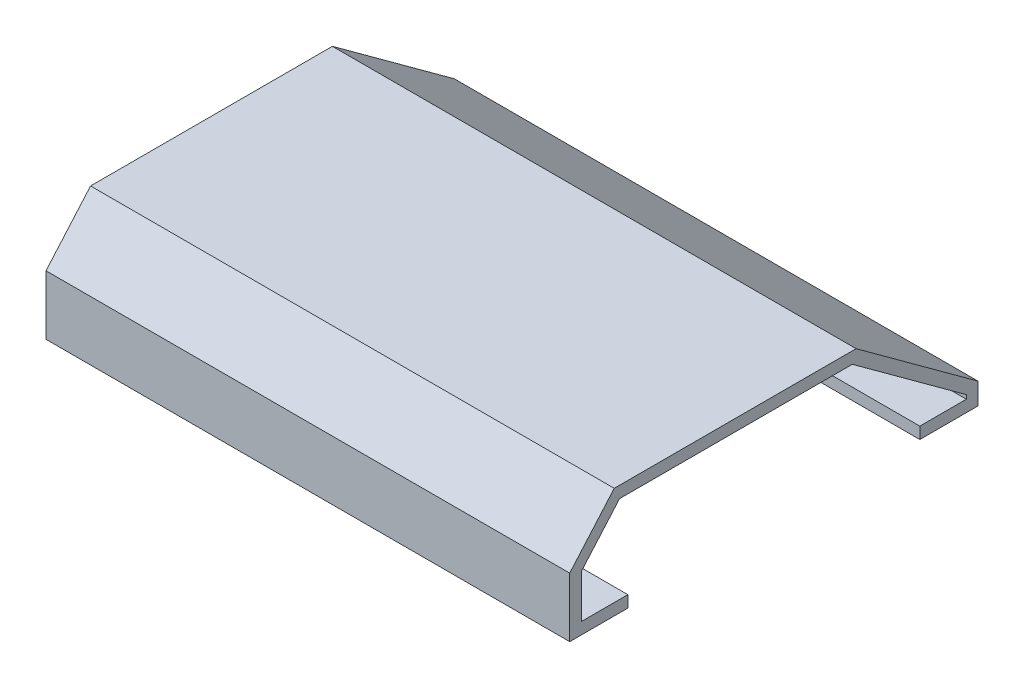
ISO-10303-21;
HEADER;
FILE_DESCRIPTION(('STEP AP214'),'2;1');
FILE_NAME('part.step','',(''),(''),'','','');
FILE_SCHEMA(('AUTOMOTIVE_DESIGN { 1 0 10303 214 1 1 1 1 }'));
ENDSEC;
DATA;
#1=APPLICATION_CONTEXT('core data for automotive mechanical design processes');
#2=APPLICATION_PROTOCOL_DEFINITION('international standard','automotive_design',2000,#1);
#3=PRODUCT_CONTEXT('',#1,'mechanical');
#4=PRODUCT('Part','Part','',(#3));
#5=PRODUCT_RELATED_PRODUCT_CATEGORY('part','',(#4));
#6=PRODUCT_DEFINITION_FORMATION('','',#4);
#7=PRODUCT_DEFINITION_CONTEXT('part definition',#1,'design');
#8=PRODUCT_DEFINITION('design','',#6,#7);
#9=PRODUCT_DEFINITION_SHAPE('','',#8);
#10=(LENGTH_UNIT() NAMED_UNIT(*) SI_UNIT(.MILLI.,.METRE.));
#11=(NAMED_UNIT(*) PLANE_ANGLE_UNIT() SI_UNIT($,.RADIAN.));
#12=(NAMED_UNIT(*) SI_UNIT($,.STERADIAN.) SOLID_ANGLE_UNIT());
#13=UNCERTAINTY_MEASURE_WITH_UNIT(LENGTH_MEASURE(1.E-05),#10,'distance_accuracy_value','');
#14=(GEOMETRIC_REPRESENTATION_CONTEXT(3) GLOBAL_UNCERTAINTY_ASSIGNED_CONTEXT((#13)) GLOBAL_UNIT_ASSIGNED_CONTEXT((#10,
#11,#12)) REPRESENTATION_CONTEXT('',''));
#15=CARTESIAN_POINT('',(0.,0.,0.));
#16=DIRECTION('',(0.,0.,1.));
#17=DIRECTION('',(1.,0.,0.));
#18=AXIS2_PLACEMENT_3D('',#15,#16,#17);
#19=CARTESIAN_POINT('',(90.,0.,26.2194785332124));
#20=DIRECTION('',(0.,0.,1.));
#21=DIRECTION('',(1.,0.,0.));
#22=AXIS2_PLACEMENT_3D('',#19,#20,#21);
#23=PLANE('',#22);
#24=DIRECTION('',(0.,1.,0.));
#25=VECTOR('',#24,1.);
#26=CARTESIAN_POINT('',(0.,0.,26.2194785332124));
#27=LINE('',#26,#25);
#28=CARTESIAN_POINT('',(0.,-2.,26.2194785332124));
#29=VERTEX_POINT('',#28);
#30=CARTESIAN_POINT('',(0.,0.,26.2194785332124));
#31=VERTEX_POINT('',#30);
#32=EDGE_CURVE('E177',#29,#31,#27,.T.);
#33=ORIENTED_EDGE('',*,*,#32,.T.);
#34=DIRECTION('',(-1.,0.,0.));
#35=VECTOR('',#34,1.);
#36=CARTESIAN_POINT('',(90.,0.,26.2194785332124));
#37=LINE('',#36,#35);
#38=CARTESIAN_POINT('',(90.,0.,26.2194785332124));
#39=VERTEX_POINT('',#38);
#40=EDGE_CURVE('E11',#39,#31,#37,.T.);
#41=ORIENTED_EDGE('',*,*,#40,.F.);
#42=DIRECTION('',(0.,1.,0.));
#43=VECTOR('',#42,1.);
#44=CARTESIAN_POINT('',(90.,0.,26.2194785332124));
#45=LINE('',#44,#43);
#46=CARTESIAN_POINT('',(90.,-2.,26.2194785332124));
#47=VERTEX_POINT('',#46);
#48=EDGE_CURVE('E207',#47,#39,#45,.T.);
#49=ORIENTED_EDGE('',*,*,#48,.F.);
#50=DIRECTION('',(-1.,0.,0.));
#51=VECTOR('',#50,1.);
#52=CARTESIAN_POINT('',(90.,-2.,26.2194785332124));
#53=LINE('',#52,#51);
#54=EDGE_CURVE('E173',#47,#29,#53,.T.);
#55=ORIENTED_EDGE('',*,*,#54,.T.);
#56=EDGE_LOOP('',(#33,#41,#49,#55));
#57=FACE_BOUND('',#56,.T.);
#58=ADVANCED_FACE('F33',(#57),#23,.F.);
#59=CARTESIAN_POINT('',(90.,0.,26.2194785332124));
#60=DIRECTION('',(0.,-1.,0.));
#61=DIRECTION('',(0.,0.,-1.));
#62=AXIS2_PLACEMENT_3D('',#59,#60,#61);
#63=PLANE('',#62);
#64=DIRECTION('',(0.,0.,1.));
#65=VECTOR('',#64,1.);
#66=CARTESIAN_POINT('',(0.,0.,26.2194785332124));
#67=LINE('',#66,#65);
#68=CARTESIAN_POINT('',(0.,0.,34.2194785332124));
#69=VERTEX_POINT('',#68);
#70=EDGE_CURVE('E180',#31,#69,#67,.T.);
#71=ORIENTED_EDGE('',*,*,#70,.T.);
#72=DIRECTION('',(-1.,0.,0.));
#73=VECTOR('',#72,1.);
#74=CARTESIAN_POINT('',(90.,0.,34.2194785332124));
#75=LINE('',#74,#73);
#76=CARTESIAN_POINT('',(90.,0.,34.2194785332124));
#77=VERTEX_POINT('',#76);
#78=EDGE_CURVE('E41',#77,#69,#75,.T.);
#79=ORIENTED_EDGE('',*,*,#78,.F.);
#80=DIRECTION('',(0.,0.,1.));
#81=VECTOR('',#80,1.);
#82=CARTESIAN_POINT('',(90.,0.,26.2194785332124));
#83=LINE('',#82,#81);
#84=EDGE_CURVE('E116',#39,#77,#83,.T.);
#85=ORIENTED_EDGE('',*,*,#84,.F.);
#86=ORIENTED_EDGE('',*,*,#40,.T.);
#87=EDGE_LOOP('',(#71,#79,#85,#86));
#88=FACE_BOUND('',#87,.T.);
#89=ADVANCED_FACE('F305',(#88),#63,.F.);
#90=CARTESIAN_POINT('',(90.,0.,34.2194785332124));
#91=DIRECTION('',(0.,0.,1.));
#92=DIRECTION('',(1.,0.,0.));
#93=AXIS2_PLACEMENT_3D('',#90,#91,#92);
#94=PLANE('',#93);
#95=DIRECTION('',(0.,1.,0.));
#96=VECTOR('',#95,1.);
#97=CARTESIAN_POINT('',(0.,0.,34.2194785332124));
#98=LINE('',#97,#96);
#99=CARTESIAN_POINT('',(0.,7.45589180423551,34.2194785332124));
#100=VERTEX_POINT('',#99);
#101=EDGE_CURVE('E182',#69,#100,#98,.T.);
#102=ORIENTED_EDGE('',*,*,#101,.T.);
#103=DIRECTION('',(-1.,0.,0.));
#104=VECTOR('',#103,1.);
#105=CARTESIAN_POINT('',(90.,7.45589180423551,34.2194785332124));
#106=LINE('',#105,#104);
#107=CARTESIAN_POINT('',(90.,7.45589180423551,34.2194785332124));
#108=VERTEX_POINT('',#107);
#109=EDGE_CURVE('E238',#108,#100,#106,.T.);
#110=ORIENTED_EDGE('',*,*,#109,.F.);
#111=DIRECTION('',(0.,1.,0.));
#112=VECTOR('',#111,1.);
#113=CARTESIAN_POINT('',(90.,0.,34.2194785332124));
#114=LINE('',#113,#112);
#115=EDGE_CURVE('E246',#77,#108,#114,.T.);
#116=ORIENTED_EDGE('',*,*,#115,.F.);
#117=ORIENTED_EDGE('',*,*,#78,.T.);
#118=EDGE_LOOP('',(#102,#110,#116,#117));
#119=FACE_BOUND('',#118,.T.);
#120=ADVANCED_FACE('F244',(#119),#94,.F.);
#121=CARTESIAN_POINT('',(90.,7.45589180423551,34.2194785332124));
#122=DIRECTION('',(0.,0.656402555834445,0.754410819576448));
#123=DIRECTION('',(0.,-0.754410819576448,0.656402555834445));
#124=AXIS2_PLACEMENT_3D('',#121,#122,#123);
#125=PLANE('',#124);
#126=DIRECTION('',(0.,0.754410819576448,-0.656402555834445));
#127=VECTOR('',#126,1.);
#128=CARTESIAN_POINT('',(0.,7.45589180423551,34.2194785332124));
#129=LINE('',#128,#127);
#130=CARTESIAN_POINT('',(0.,15.,27.655452974868));
#131=VERTEX_POINT('',#130);
#132=EDGE_CURVE('E184',#100,#131,#129,.T.);
#133=ORIENTED_EDGE('',*,*,#132,.T.);
#134=DIRECTION('',(-1.,0.,0.));
#135=VECTOR('',#134,1.);
#136=CARTESIAN_POINT('',(90.,15.,27.655452974868));
#137=LINE('',#136,#135);
#138=CARTESIAN_POINT('',(90.,15.,27.655452974868));
#139=VERTEX_POINT('',#138);
#140=EDGE_CURVE('E235',#139,#131,#137,.T.);
#141=ORIENTED_EDGE('',*,*,#140,.F.);
#142=DIRECTION('',(0.,0.754410819576448,-0.656402555834445));
#143=VECTOR('',#142,1.);
#144=CARTESIAN_POINT('',(90.,7.45589180423551,34.2194785332124));
#145=LINE('',#144,#143);
#146=EDGE_CURVE('E264',#108,#139,#145,.T.);
#147=ORIENTED_EDGE('',*,*,#146,.F.);
#148=ORIENTED_EDGE('',*,*,#109,.T.);
#149=EDGE_LOOP('',(#133,#141,#147,#148));
#150=FACE_BOUND('',#149,.T.);
#151=ADVANCED_FACE('F255',(#150),#125,.F.);
#152=CARTESIAN_POINT('',(90.,15.,27.655452974868));
#153=DIRECTION('',(0.,1.,0.));
#154=DIRECTION('',(0.,0.,1.));
#155=AXIS2_PLACEMENT_3D('',#152,#153,#154);
#156=PLANE('',#155);
#157=DIRECTION('',(0.,0.,-1.));
#158=VECTOR('',#157,1.);
#159=CARTESIAN_POINT('',(0.,15.,27.655452974868));
#160=LINE('',#159,#158);
#161=CARTESIAN_POINT('',(0.,15.,-12.344547025132));
#162=VERTEX_POINT('',#161);
#163=EDGE_CURVE('E186',#131,#162,#160,.T.);
#164=ORIENTED_EDGE('',*,*,#163,.T.);
#165=DIRECTION('',(-1.,0.,0.));
#166=VECTOR('',#165,1.);
#167=CARTESIAN_POINT('',(90.,15.,-12.344547025132));
#168=LINE('',#167,#166);
#169=CARTESIAN_POINT('',(90.,15.,-12.344547025132));
#170=VERTEX_POINT('',#169);
#171=EDGE_CURVE('E232',#170,#162,#168,.T.);
#172=ORIENTED_EDGE('',*,*,#171,.F.);
#173=DIRECTION('',(0.,0.,-1.));
#174=VECTOR('',#173,1.);
#175=CARTESIAN_POINT('',(90.,15.,27.655452974868));
#176=LINE('',#175,#174);
#177=EDGE_CURVE('E261',#139,#170,#176,.T.);
#178=ORIENTED_EDGE('',*,*,#177,.F.);
#179=ORIENTED_EDGE('',*,*,#140,.T.);
#180=EDGE_LOOP('',(#164,#172,#178,#179));
#181=FACE_BOUND('',#180,.T.);
#182=ADVANCED_FACE('F259',(#181),#156,.F.);
#183=CARTESIAN_POINT('',(90.,15.,-12.344547025132));
#184=DIRECTION('',(0.,0.807535153155917,-0.589819443912668));
#185=DIRECTION('',(0.,0.589819443912668,0.807535153155917));
#186=AXIS2_PLACEMENT_3D('',#183,#184,#185);
#187=PLANE('',#186);
#188=DIRECTION('',(0.,-0.589819443912668,-0.807535153155917));
#189=VECTOR('',#188,1.);
#190=CARTESIAN_POINT('',(0.,15.,-12.344547025132));
#191=LINE('',#190,#189);
#192=CARTESIAN_POINT('',(0.,0.680147815311035,-31.950180827949));
#193=VERTEX_POINT('',#192);
#194=EDGE_CURVE('E188',#162,#193,#191,.T.);
#195=ORIENTED_EDGE('',*,*,#194,.T.);
#196=DIRECTION('',(-1.,0.,0.));
#197=VECTOR('',#196,1.);
#198=CARTESIAN_POINT('',(90.,0.680147815311035,-31.950180827949));
#199=LINE('',#198,#197);
#200=CARTESIAN_POINT('',(90.,0.680147815311035,-31.950180827949));
#201=VERTEX_POINT('',#200);
#202=EDGE_CURVE('E229',#201,#193,#199,.T.);
#203=ORIENTED_EDGE('',*,*,#202,.F.);
#204=DIRECTION('',(0.,-0.589819443912668,-0.807535153155917));
#205=VECTOR('',#204,1.);
#206=CARTESIAN_POINT('',(90.,15.,-12.344547025132));
#207=LINE('',#206,#205);
#208=EDGE_CURVE('E263',#170,#201,#207,.T.);
#209=ORIENTED_EDGE('',*,*,#208,.F.);
#210=ORIENTED_EDGE('',*,*,#171,.T.);
#211=EDGE_LOOP('',(#195,#203,#209,#210));
#212=FACE_BOUND('',#211,.T.);
#213=ADVANCED_FACE('F318',(#212),#187,.F.);
#214=CARTESIAN_POINT('',(90.,0.680147815311035,-31.950180827949));
#215=DIRECTION('',(0.,0.,-1.));
#216=DIRECTION('',(-1.,0.,0.));
#217=AXIS2_PLACEMENT_3D('',#214,#215,#216);
#218=PLANE('',#217);
#219=DIRECTION('',(0.,-1.,0.));
#220=VECTOR('',#219,1.);
#221=CARTESIAN_POINT('',(0.,0.680147815311035,-31.950180827949));
#222=LINE('',#221,#220);
#223=CARTESIAN_POINT('',(0.,0.,-31.950180827949));
#224=VERTEX_POINT('',#223);
#225=EDGE_CURVE('E190',#193,#224,#222,.T.);
#226=ORIENTED_EDGE('',*,*,#225,.T.);
#227=DIRECTION('',(-1.,0.,0.));
#228=VECTOR('',#227,1.);
#229=CARTESIAN_POINT('',(90.,0.,-31.950180827949));
#230=LINE('',#229,#228);
#231=CARTESIAN_POINT('',(90.,0.,-31.950180827949));
#232=VERTEX_POINT('',#231);
#233=EDGE_CURVE('E226',#232,#224,#230,.T.);
#234=ORIENTED_EDGE('',*,*,#233,.F.);
#235=DIRECTION('',(0.,-1.,0.));
#236=VECTOR('',#235,1.);
#237=CARTESIAN_POINT('',(90.,0.680147815311035,-31.950180827949));
#238=LINE('',#237,#236);
#239=EDGE_CURVE('E266',#201,#232,#238,.T.);
#240=ORIENTED_EDGE('',*,*,#239,.F.);
#241=ORIENTED_EDGE('',*,*,#202,.T.);
#242=EDGE_LOOP('',(#226,#234,#240,#241));
#243=FACE_BOUND('',#242,.T.);
#244=ADVANCED_FACE('F321',(#243),#218,.F.);
#245=CARTESIAN_POINT('',(90.,0.,-31.950180827949));
#246=DIRECTION('',(0.,-1.,0.));
#247=DIRECTION('',(0.,0.,-1.));
#248=AXIS2_PLACEMENT_3D('',#245,#246,#247);
#249=PLANE('',#248);
#250=DIRECTION('',(0.,0.,1.));
#251=VECTOR('',#250,1.);
#252=CARTESIAN_POINT('',(0.,0.,-31.950180827949));
#253=LINE('',#252,#251);
#254=CARTESIAN_POINT('',(0.,0.,-23.950180827949));
#255=VERTEX_POINT('',#254);
#256=EDGE_CURVE('E192',#224,#255,#253,.T.);
#257=ORIENTED_EDGE('',*,*,#256,.T.);
#258=DIRECTION('',(-1.,0.,0.));
#259=VECTOR('',#258,1.);
#260=CARTESIAN_POINT('',(90.,0.,-23.950180827949));
#261=LINE('',#260,#259);
#262=CARTESIAN_POINT('',(90.,0.,-23.950180827949));
#263=VERTEX_POINT('',#262);
#264=EDGE_CURVE('E223',#263,#255,#261,.T.);
#265=ORIENTED_EDGE('',*,*,#264,.F.);
#266=DIRECTION('',(0.,0.,1.));
#267=VECTOR('',#266,1.);
#268=CARTESIAN_POINT('',(90.,0.,-31.950180827949));
#269=LINE('',#268,#267);
#270=EDGE_CURVE('E272',#232,#263,#269,.T.);
#271=ORIENTED_EDGE('',*,*,#270,.F.);
#272=ORIENTED_EDGE('',*,*,#233,.T.);
#273=EDGE_LOOP('',(#257,#265,#271,#272));
#274=FACE_BOUND('',#273,.T.);
#275=ADVANCED_FACE('F325',(#274),#249,.F.);
#276=CARTESIAN_POINT('',(90.,0.,-23.950180827949));
#277=DIRECTION('',(0.,0.,-1.));
#278=DIRECTION('',(-1.,0.,0.));
#279=AXIS2_PLACEMENT_3D('',#276,#277,#278);
#280=PLANE('',#279);
#281=DIRECTION('',(0.,-1.,0.));
#282=VECTOR('',#281,1.);
#283=CARTESIAN_POINT('',(0.,0.,-23.950180827949));
#284=LINE('',#283,#282);
#285=CARTESIAN_POINT('',(0.,-2.,-23.950180827949));
#286=VERTEX_POINT('',#285);
#287=EDGE_CURVE('E194',#255,#286,#284,.T.);
#288=ORIENTED_EDGE('',*,*,#287,.T.);
#289=DIRECTION('',(-1.,0.,0.));
#290=VECTOR('',#289,1.);
#291=CARTESIAN_POINT('',(90.,-2.,-23.950180827949));
#292=LINE('',#291,#290);
#293=CARTESIAN_POINT('',(90.,-2.,-23.950180827949));
#294=VERTEX_POINT('',#293);
#295=EDGE_CURVE('E220',#294,#286,#292,.T.);
#296=ORIENTED_EDGE('',*,*,#295,.F.);
#297=DIRECTION('',(0.,-1.,0.));
#298=VECTOR('',#297,1.);
#299=CARTESIAN_POINT('',(90.,0.,-23.950180827949));
#300=LINE('',#299,#298);
#301=EDGE_CURVE('E274',#263,#294,#300,.T.);
#302=ORIENTED_EDGE('',*,*,#301,.F.);
#303=ORIENTED_EDGE('',*,*,#264,.T.);
#304=EDGE_LOOP('',(#288,#296,#302,#303));
#305=FACE_BOUND('',#304,.T.);
#306=ADVANCED_FACE('F329',(#305),#280,.F.);
#307=CARTESIAN_POINT('',(90.,-2.,-33.950180827949));
#308=DIRECTION('',(0.,1.,0.));
#309=DIRECTION('',(0.,0.,1.));
#310=AXIS2_PLACEMENT_3D('',#307,#308,#309);
#311=PLANE('',#310);
#312=DIRECTION('',(0.,0.,-1.));
#313=VECTOR('',#312,1.);
#314=CARTESIAN_POINT('',(0.,-2.,-33.950180827949));
#315=LINE('',#314,#313);
#316=CARTESIAN_POINT('',(0.,-2.,-33.950180827949));
#317=VERTEX_POINT('',#316);
#318=EDGE_CURVE('E196',#286,#317,#315,.T.);
#319=ORIENTED_EDGE('',*,*,#318,.T.);
#320=DIRECTION('',(-1.,0.,0.));
#321=VECTOR('',#320,1.);
#322=CARTESIAN_POINT('',(90.,-2.,-33.950180827949));
#323=LINE('',#322,#321);
#324=CARTESIAN_POINT('',(90.,-2.,-33.950180827949));
#325=VERTEX_POINT('',#324);
#326=EDGE_CURVE('E217',#325,#317,#323,.T.);
#327=ORIENTED_EDGE('',*,*,#326,.F.);
#328=DIRECTION('',(0.,0.,-1.));
#329=VECTOR('',#328,1.);
#330=CARTESIAN_POINT('',(90.,-2.,-33.950180827949));
#331=LINE('',#330,#329);
#332=EDGE_CURVE('E276',#294,#325,#331,.T.);
#333=ORIENTED_EDGE('',*,*,#332,.F.);
#334=ORIENTED_EDGE('',*,*,#295,.T.);
#335=EDGE_LOOP('',(#319,#327,#333,#334));
#336=FACE_BOUND('',#335,.T.);
#337=ADVANCED_FACE('F333',(#336),#311,.F.);
#338=CARTESIAN_POINT('',(90.,1.69603066445837,-33.950180827949));
#339=DIRECTION('',(0.,0.,1.));
#340=DIRECTION('',(1.,0.,0.));
#341=AXIS2_PLACEMENT_3D('',#338,#339,#340);
#342=PLANE('',#341);
#343=DIRECTION('',(0.,1.,0.));
#344=VECTOR('',#343,1.);
#345=CARTESIAN_POINT('',(0.,1.69603066445837,-33.950180827949));
#346=LINE('',#345,#344);
#347=CARTESIAN_POINT('',(0.,1.69603066445837,-33.950180827949));
#348=VERTEX_POINT('',#347);
#349=EDGE_CURVE('E198',#317,#348,#346,.T.);
#350=ORIENTED_EDGE('',*,*,#349,.T.);
#351=DIRECTION('',(-1.,0.,0.));
#352=VECTOR('',#351,1.);
#353=CARTESIAN_POINT('',(90.,1.69603066445837,-33.950180827949));
#354=LINE('',#353,#352);
#355=CARTESIAN_POINT('',(90.,1.69603066445837,-33.950180827949));
#356=VERTEX_POINT('',#355);
#357=EDGE_CURVE('E214',#356,#348,#354,.T.);
#358=ORIENTED_EDGE('',*,*,#357,.F.);
#359=DIRECTION('',(0.,1.,0.));
#360=VECTOR('',#359,1.);
#361=CARTESIAN_POINT('',(90.,1.69603066445837,-33.950180827949));
#362=LINE('',#361,#360);
#363=EDGE_CURVE('E278',#325,#356,#362,.T.);
#364=ORIENTED_EDGE('',*,*,#363,.F.);
#365=ORIENTED_EDGE('',*,*,#326,.T.);
#366=EDGE_LOOP('',(#350,#358,#364,#365));
#367=FACE_BOUND('',#366,.T.);
#368=ADVANCED_FACE('F337',(#367),#342,.F.);
#369=CARTESIAN_POINT('',(90.,17.,-12.9971699551844));
#370=DIRECTION('',(0.,-0.807535153155917,0.589819443912668));
#371=DIRECTION('',(0.,-0.589819443912668,-0.807535153155917));
#372=AXIS2_PLACEMENT_3D('',#369,#370,#371);
#373=PLANE('',#372);
#374=DIRECTION('',(0.,0.589819443912668,0.807535153155917));
#375=VECTOR('',#374,1.);
#376=CARTESIAN_POINT('',(0.,17.,-12.9971699551844));
#377=LINE('',#376,#375);
#378=CARTESIAN_POINT('',(0.,17.,-12.9971699551844));
#379=VERTEX_POINT('',#378);
#380=EDGE_CURVE('E200',#348,#379,#377,.T.);
#381=ORIENTED_EDGE('',*,*,#380,.T.);
#382=DIRECTION('',(-1.,0.,0.));
#383=VECTOR('',#382,1.);
#384=CARTESIAN_POINT('',(90.,17.,-12.9971699551844));
#385=LINE('',#384,#383);
#386=CARTESIAN_POINT('',(90.,17.,-12.9971699551844));
#387=VERTEX_POINT('',#386);
#388=EDGE_CURVE('E211',#387,#379,#385,.T.);
#389=ORIENTED_EDGE('',*,*,#388,.F.);
#390=DIRECTION('',(0.,0.589819443912668,0.807535153155917));
#391=VECTOR('',#390,1.);
#392=CARTESIAN_POINT('',(90.,17.,-12.9971699551844));
#393=LINE('',#392,#391);
#394=EDGE_CURVE('E280',#356,#387,#393,.T.);
#395=ORIENTED_EDGE('',*,*,#394,.F.);
#396=ORIENTED_EDGE('',*,*,#357,.T.);
#397=EDGE_LOOP('',(#381,#389,#395,#396));
#398=FACE_BOUND('',#397,.T.);
#399=ADVANCED_FACE('F286',(#398),#373,.F.);
#400=CARTESIAN_POINT('',(90.,17.,28.5663557224146));
#401=DIRECTION('',(0.,-1.,0.));
#402=DIRECTION('',(0.,0.,-1.));
#403=AXIS2_PLACEMENT_3D('',#400,#401,#402);
#404=PLANE('',#403);
#405=DIRECTION('',(0.,0.,1.));
#406=VECTOR('',#405,1.);
#407=CARTESIAN_POINT('',(0.,17.,28.5663557224146));
#408=LINE('',#407,#406);
#409=CARTESIAN_POINT('',(0.,17.,28.5663557224146));
#410=VERTEX_POINT('',#409);
#411=EDGE_CURVE('E202',#379,#410,#408,.T.);
#412=ORIENTED_EDGE('',*,*,#411,.T.);
#413=DIRECTION('',(-1.,0.,0.));
#414=VECTOR('',#413,1.);
#415=CARTESIAN_POINT('',(90.,17.,28.5663557224146));
#416=LINE('',#415,#414);
#417=CARTESIAN_POINT('',(90.,17.,28.5663557224146));
#418=VERTEX_POINT('',#417);
#419=EDGE_CURVE('E168',#418,#410,#416,.T.);
#420=ORIENTED_EDGE('',*,*,#419,.F.);
#421=DIRECTION('',(0.,0.,1.));
#422=VECTOR('',#421,1.);
#423=CARTESIAN_POINT('',(90.,17.,28.5663557224146));
#424=LINE('',#423,#422);
#425=EDGE_CURVE('E159',#387,#418,#424,.T.);
#426=ORIENTED_EDGE('',*,*,#425,.F.);
#427=ORIENTED_EDGE('',*,*,#388,.T.);
#428=EDGE_LOOP('',(#412,#420,#426,#427));
#429=FACE_BOUND('',#428,.T.);
#430=ADVANCED_FACE('F290',(#429),#404,.F.);
#431=CARTESIAN_POINT('',(90.,8.2041801167676,36.2194785332124));
#432=DIRECTION('',(0.,-0.656402555834445,-0.754410819576449));
#433=DIRECTION('',(0.,0.754410819576449,-0.656402555834445));
#434=AXIS2_PLACEMENT_3D('',#431,#432,#433);
#435=PLANE('',#434);
#436=DIRECTION('',(0.,-0.754410819576449,0.656402555834445));
#437=VECTOR('',#436,1.);
#438=CARTESIAN_POINT('',(0.,8.2041801167676,36.2194785332124));
#439=LINE('',#438,#437);
#440=CARTESIAN_POINT('',(0.,8.2041801167676,36.2194785332124));
#441=VERTEX_POINT('',#440);
#442=EDGE_CURVE('E167',#410,#441,#439,.T.);
#443=ORIENTED_EDGE('',*,*,#442,.T.);
#444=DIRECTION('',(-1.,0.,0.));
#445=VECTOR('',#444,1.);
#446=CARTESIAN_POINT('',(90.,8.2041801167676,36.2194785332124));
#447=LINE('',#446,#445);
#448=CARTESIAN_POINT('',(90.,8.2041801167676,36.2194785332124));
#449=VERTEX_POINT('',#448);
#450=EDGE_CURVE('E164',#449,#441,#447,.T.);
#451=ORIENTED_EDGE('',*,*,#450,.F.);
#452=DIRECTION('',(0.,-0.754410819576449,0.656402555834445));
#453=VECTOR('',#452,1.);
#454=CARTESIAN_POINT('',(90.,8.2041801167676,36.2194785332124));
#455=LINE('',#454,#453);
#456=EDGE_CURVE('E153',#418,#449,#455,.T.);
#457=ORIENTED_EDGE('',*,*,#456,.F.);
#458=ORIENTED_EDGE('',*,*,#419,.T.);
#459=EDGE_LOOP('',(#443,#451,#457,#458));
#460=FACE_BOUND('',#459,.T.);
#461=ADVANCED_FACE('F165',(#460),#435,.F.);
#462=CARTESIAN_POINT('',(90.,-2.,36.2194785332124));
#463=DIRECTION('',(0.,0.,-1.));
#464=DIRECTION('',(-1.,0.,0.));
#465=AXIS2_PLACEMENT_3D('',#462,#463,#464);
#466=PLANE('',#465);
#467=DIRECTION('',(0.,-1.,0.));
#468=VECTOR('',#467,1.);
#469=CARTESIAN_POINT('',(0.,-2.,36.2194785332124));
#470=LINE('',#469,#468);
#471=CARTESIAN_POINT('',(0.,-2.,36.2194785332124));
#472=VERTEX_POINT('',#471);
#473=EDGE_CURVE('E102',#441,#472,#470,.T.);
#474=ORIENTED_EDGE('',*,*,#473,.T.);
#475=DIRECTION('',(-1.,0.,0.));
#476=VECTOR('',#475,1.);
#477=CARTESIAN_POINT('',(90.,-2.,36.2194785332124));
#478=LINE('',#477,#476);
#479=CARTESIAN_POINT('',(90.,-2.,36.2194785332124));
#480=VERTEX_POINT('',#479);
#481=EDGE_CURVE('E169',#480,#472,#478,.T.);
#482=ORIENTED_EDGE('',*,*,#481,.F.);
#483=DIRECTION('',(0.,-1.,0.));
#484=VECTOR('',#483,1.);
#485=CARTESIAN_POINT('',(90.,-2.,36.2194785332124));
#486=LINE('',#485,#484);
#487=EDGE_CURVE('E157',#449,#480,#486,.T.);
#488=ORIENTED_EDGE('',*,*,#487,.F.);
#489=ORIENTED_EDGE('',*,*,#450,.T.);
#490=EDGE_LOOP('',(#474,#482,#488,#489));
#491=FACE_BOUND('',#490,.T.);
#492=ADVANCED_FACE('F171',(#491),#466,.F.);
#493=CARTESIAN_POINT('',(90.,-2.,26.2194785332124));
#494=DIRECTION('',(0.,1.,0.));
#495=DIRECTION('',(0.,0.,1.));
#496=AXIS2_PLACEMENT_3D('',#493,#494,#495);
#497=PLANE('',#496);
#498=DIRECTION('',(0.,0.,-1.));
#499=VECTOR('',#498,1.);
#500=CARTESIAN_POINT('',(0.,-2.,26.2194785332124));
#501=LINE('',#500,#499);
#502=EDGE_CURVE('E108',#472,#29,#501,.T.);
#503=ORIENTED_EDGE('',*,*,#502,.T.);
#504=ORIENTED_EDGE('',*,*,#54,.F.);
#505=DIRECTION('',(0.,0.,-1.));
#506=VECTOR('',#505,1.);
#507=CARTESIAN_POINT('',(90.,-2.,26.2194785332124));
#508=LINE('',#507,#506);
#509=EDGE_CURVE('E49',#480,#47,#508,.T.);
#510=ORIENTED_EDGE('',*,*,#509,.F.);
#511=ORIENTED_EDGE('',*,*,#481,.T.);
#512=EDGE_LOOP('',(#503,#504,#510,#511));
#513=FACE_BOUND('',#512,.T.);
#514=ADVANCED_FACE('F294',(#513),#497,.F.);
#515=CARTESIAN_POINT('',(90.,0.,0.));
#516=DIRECTION('',(-1.,0.,0.));
#517=DIRECTION('',(0.,0.,1.));
#518=AXIS2_PLACEMENT_3D('',#515,#516,#517);
#519=PLANE('',#518);
#520=ORIENTED_EDGE('',*,*,#48,.T.);
#521=ORIENTED_EDGE('',*,*,#84,.T.);
#522=ORIENTED_EDGE('',*,*,#115,.T.);
#523=ORIENTED_EDGE('',*,*,#146,.T.);
#524=ORIENTED_EDGE('',*,*,#177,.T.);
#525=ORIENTED_EDGE('',*,*,#208,.T.);
#526=ORIENTED_EDGE('',*,*,#239,.T.);
#527=ORIENTED_EDGE('',*,*,#270,.T.);
#528=ORIENTED_EDGE('',*,*,#301,.T.);
#529=ORIENTED_EDGE('',*,*,#332,.T.);
#530=ORIENTED_EDGE('',*,*,#363,.T.);
#531=ORIENTED_EDGE('',*,*,#394,.T.);
#532=ORIENTED_EDGE('',*,*,#425,.T.);
#533=ORIENTED_EDGE('',*,*,#456,.T.);
#534=ORIENTED_EDGE('',*,*,#487,.T.);
#535=ORIENTED_EDGE('',*,*,#509,.T.);
#536=EDGE_LOOP('',(#520,#521,#522,#523,#524,#525,#526,#527,#528,#529,#530,#531,#532,#533,#534,#535));
#537=FACE_BOUND('',#536,.T.);
#538=ADVANCED_FACE('F155',(#537),#519,.F.);
#539=CARTESIAN_POINT('',(0.,0.,0.));
#540=DIRECTION('',(-1.,0.,0.));
#541=DIRECTION('',(0.,0.,1.));
#542=AXIS2_PLACEMENT_3D('',#539,#540,#541);
#543=PLANE('',#542);
#544=ORIENTED_EDGE('',*,*,#32,.F.);
#545=ORIENTED_EDGE('',*,*,#502,.F.);
#546=ORIENTED_EDGE('',*,*,#473,.F.);
#547=ORIENTED_EDGE('',*,*,#442,.F.);
#548=ORIENTED_EDGE('',*,*,#411,.F.);
#549=ORIENTED_EDGE('',*,*,#380,.F.);
#550=ORIENTED_EDGE('',*,*,#349,.F.);
#551=ORIENTED_EDGE('',*,*,#318,.F.);
#552=ORIENTED_EDGE('',*,*,#287,.F.);
#553=ORIENTED_EDGE('',*,*,#256,.F.);
#554=ORIENTED_EDGE('',*,*,#225,.F.);
#555=ORIENTED_EDGE('',*,*,#194,.F.);
#556=ORIENTED_EDGE('',*,*,#163,.F.);
#557=ORIENTED_EDGE('',*,*,#132,.F.);
#558=ORIENTED_EDGE('',*,*,#101,.F.);
#559=ORIENTED_EDGE('',*,*,#70,.F.);
#560=EDGE_LOOP('',(#544,#545,#546,#547,#548,#549,#550,#551,#552,#553,#554,#555,#556,#557,#558,#559));
#561=FACE_BOUND('',#560,.T.);
#562=ADVANCED_FACE('F250',(#561),#543,.T.);
#563=CLOSED_SHELL('',(#58,#89,#120,#151,#182,#213,#244,#275,#306,#337,#368,#399,#430,#461,#492,
#514,#538,#562));
#564=MANIFOLD_SOLID_BREP('B2',#563);
#565=ADVANCED_BREP_SHAPE_REPRESENTATION('',(#18,#564),#14);
#566=SHAPE_DEFINITION_REPRESENTATION(#9,#565);
ENDSEC;
END-ISO-10303-21;
